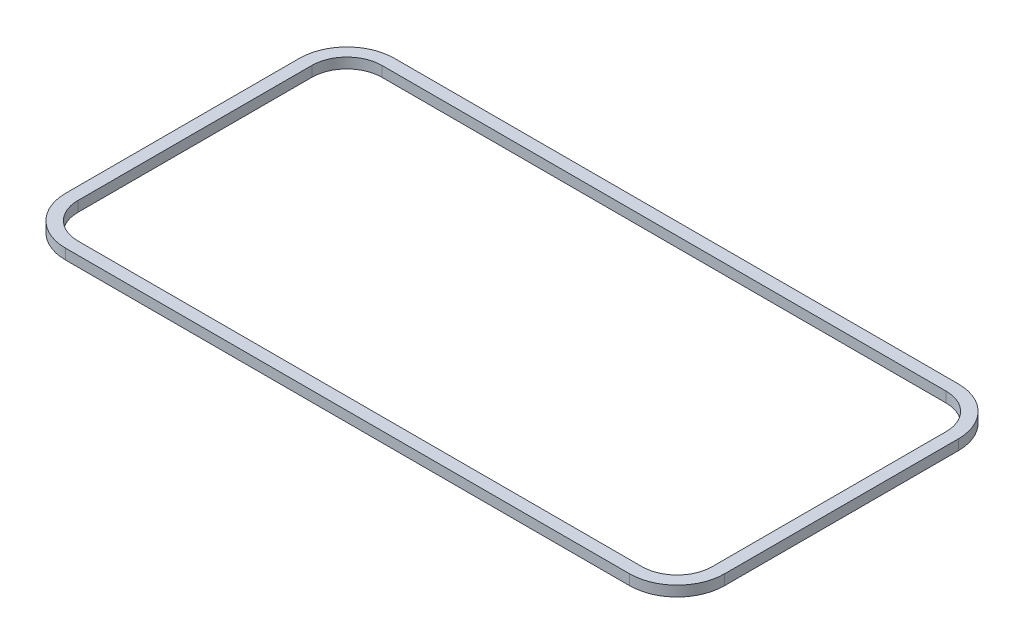
ISO-10303-21;
HEADER;
FILE_DESCRIPTION(('STEP AP214'),'2;1');
FILE_NAME('part.step','',(''),(''),'','','');
FILE_SCHEMA(('AUTOMOTIVE_DESIGN { 1 0 10303 214 1 1 1 1 }'));
ENDSEC;
DATA;
#1=APPLICATION_CONTEXT('core data for automotive mechanical design processes');
#2=APPLICATION_PROTOCOL_DEFINITION('international standard','automotive_design',2000,#1);
#3=PRODUCT_CONTEXT('',#1,'mechanical');
#4=PRODUCT('Part','Part','',(#3));
#5=PRODUCT_RELATED_PRODUCT_CATEGORY('part','',(#4));
#6=PRODUCT_DEFINITION_FORMATION('','',#4);
#7=PRODUCT_DEFINITION_CONTEXT('part definition',#1,'design');
#8=PRODUCT_DEFINITION('design','',#6,#7);
#9=PRODUCT_DEFINITION_SHAPE('','',#8);
#10=(LENGTH_UNIT() NAMED_UNIT(*) SI_UNIT(.MILLI.,.METRE.));
#11=(NAMED_UNIT(*) PLANE_ANGLE_UNIT() SI_UNIT($,.RADIAN.));
#12=(NAMED_UNIT(*) SI_UNIT($,.STERADIAN.) SOLID_ANGLE_UNIT());
#13=UNCERTAINTY_MEASURE_WITH_UNIT(LENGTH_MEASURE(1.E-05),#10,'distance_accuracy_value','');
#14=(GEOMETRIC_REPRESENTATION_CONTEXT(3) GLOBAL_UNCERTAINTY_ASSIGNED_CONTEXT((#13)) GLOBAL_UNIT_ASSIGNED_CONTEXT((#10,
#11,#12)) REPRESENTATION_CONTEXT('',''));
#15=CARTESIAN_POINT('',(0.,0.,0.));
#16=DIRECTION('',(0.,0.,1.));
#17=DIRECTION('',(1.,0.,0.));
#18=AXIS2_PLACEMENT_3D('',#15,#16,#17);
#19=CARTESIAN_POINT('',(-41.,0.,17.));
#20=DIRECTION('',(0.,1.,0.));
#21=DIRECTION('',(0.,0.,1.));
#22=AXIS2_PLACEMENT_3D('',#19,#20,#21);
#23=PLANE('',#22);
#24=CARTESIAN_POINT('',(-41.,0.,17.));
#25=DIRECTION('',(0.,1.,0.));
#26=DIRECTION('',(0.,0.,1.));
#27=AXIS2_PLACEMENT_3D('',#24,#25,#26);
#28=CIRCLE('',#27,6.9);
#29=CARTESIAN_POINT('',(-47.9,0.,17.));
#30=VERTEX_POINT('',#29);
#31=CARTESIAN_POINT('',(-41.,0.,23.9));
#32=VERTEX_POINT('',#31);
#33=EDGE_CURVE('E222',#30,#32,#28,.T.);
#34=ORIENTED_EDGE('',*,*,#33,.T.);
#35=DIRECTION('',(1.,0.,0.));
#36=VECTOR('',#35,1.);
#37=CARTESIAN_POINT('',(-41.,0.,23.9));
#38=LINE('',#37,#36);
#39=CARTESIAN_POINT('',(41.,0.,23.9));
#40=VERTEX_POINT('',#39);
#41=EDGE_CURVE('E221',#32,#40,#38,.T.);
#42=ORIENTED_EDGE('',*,*,#41,.T.);
#43=CARTESIAN_POINT('',(41.,0.,17.));
#44=DIRECTION('',(0.,1.,0.));
#45=DIRECTION('',(0.,0.,1.));
#46=AXIS2_PLACEMENT_3D('',#43,#44,#45);
#47=CIRCLE('',#46,6.9);
#48=CARTESIAN_POINT('',(47.9,0.,17.));
#49=VERTEX_POINT('',#48);
#50=EDGE_CURVE('E230',#40,#49,#47,.T.);
#51=ORIENTED_EDGE('',*,*,#50,.T.);
#52=DIRECTION('',(0.,0.,-1.));
#53=VECTOR('',#52,1.);
#54=CARTESIAN_POINT('',(47.9,0.,17.));
#55=LINE('',#54,#53);
#56=CARTESIAN_POINT('',(47.9,0.,-17.));
#57=VERTEX_POINT('',#56);
#58=EDGE_CURVE('E228',#49,#57,#55,.T.);
#59=ORIENTED_EDGE('',*,*,#58,.T.);
#60=CARTESIAN_POINT('',(41.,0.,-17.));
#61=DIRECTION('',(0.,1.,0.));
#62=DIRECTION('',(0.,0.,1.));
#63=AXIS2_PLACEMENT_3D('',#60,#61,#62);
#64=CIRCLE('',#63,6.9);
#65=CARTESIAN_POINT('',(41.,0.,-23.9));
#66=VERTEX_POINT('',#65);
#67=EDGE_CURVE('E231',#57,#66,#64,.T.);
#68=ORIENTED_EDGE('',*,*,#67,.T.);
#69=DIRECTION('',(-1.,0.,0.));
#70=VECTOR('',#69,1.);
#71=CARTESIAN_POINT('',(41.,0.,-23.9));
#72=LINE('',#71,#70);
#73=CARTESIAN_POINT('',(-41.,0.,-23.9));
#74=VERTEX_POINT('',#73);
#75=EDGE_CURVE('E233',#66,#74,#72,.T.);
#76=ORIENTED_EDGE('',*,*,#75,.T.);
#77=CARTESIAN_POINT('',(-41.,0.,-17.));
#78=DIRECTION('',(0.,1.,0.));
#79=DIRECTION('',(0.,0.,1.));
#80=AXIS2_PLACEMENT_3D('',#77,#78,#79);
#81=CIRCLE('',#80,6.9);
#82=CARTESIAN_POINT('',(-47.9,0.,-17.));
#83=VERTEX_POINT('',#82);
#84=EDGE_CURVE('E234',#74,#83,#81,.T.);
#85=ORIENTED_EDGE('',*,*,#84,.T.);
#86=DIRECTION('',(0.,0.,1.));
#87=VECTOR('',#86,1.);
#88=CARTESIAN_POINT('',(-47.9,0.,-17.));
#89=LINE('',#88,#87);
#90=EDGE_CURVE('E240',#83,#30,#89,.T.);
#91=ORIENTED_EDGE('',*,*,#90,.T.);
#92=EDGE_LOOP('',(#34,#42,#51,#59,#68,#76,#85,#91));
#93=FACE_BOUND('',#92,.T.);
#94=DIRECTION('',(1.,0.,0.));
#95=VECTOR('',#94,1.);
#96=CARTESIAN_POINT('',(-41.,0.,22.1));
#97=LINE('',#96,#95);
#98=CARTESIAN_POINT('',(-41.,0.,22.1));
#99=VERTEX_POINT('',#98);
#100=CARTESIAN_POINT('',(41.,0.,22.1));
#101=VERTEX_POINT('',#100);
#102=EDGE_CURVE('E163',#99,#101,#97,.T.);
#103=ORIENTED_EDGE('',*,*,#102,.F.);
#104=CARTESIAN_POINT('',(-41.,0.,17.));
#105=DIRECTION('',(0.,1.,0.));
#106=DIRECTION('',(0.,0.,1.));
#107=AXIS2_PLACEMENT_3D('',#104,#105,#106);
#108=CIRCLE('',#107,5.1);
#109=CARTESIAN_POINT('',(-46.1,0.,17.));
#110=VERTEX_POINT('',#109);
#111=EDGE_CURVE('E156',#110,#99,#108,.T.);
#112=ORIENTED_EDGE('',*,*,#111,.F.);
#113=DIRECTION('',(0.,0.,1.));
#114=VECTOR('',#113,1.);
#115=CARTESIAN_POINT('',(-46.1,0.,-17.));
#116=LINE('',#115,#114);
#117=CARTESIAN_POINT('',(-46.1,0.,-17.));
#118=VERTEX_POINT('',#117);
#119=EDGE_CURVE('E188',#118,#110,#116,.T.);
#120=ORIENTED_EDGE('',*,*,#119,.F.);
#121=CARTESIAN_POINT('',(-41.,0.,-17.));
#122=DIRECTION('',(0.,1.,0.));
#123=DIRECTION('',(0.,0.,1.));
#124=AXIS2_PLACEMENT_3D('',#121,#122,#123);
#125=CIRCLE('',#124,5.1);
#126=CARTESIAN_POINT('',(-41.,0.,-22.1));
#127=VERTEX_POINT('',#126);
#128=EDGE_CURVE('E190',#127,#118,#125,.T.);
#129=ORIENTED_EDGE('',*,*,#128,.F.);
#130=DIRECTION('',(-1.,0.,0.));
#131=VECTOR('',#130,1.);
#132=CARTESIAN_POINT('',(41.,0.,-22.1));
#133=LINE('',#132,#131);
#134=CARTESIAN_POINT('',(41.,0.,-22.1));
#135=VERTEX_POINT('',#134);
#136=EDGE_CURVE('E183',#135,#127,#133,.T.);
#137=ORIENTED_EDGE('',*,*,#136,.F.);
#138=CARTESIAN_POINT('',(41.,0.,-17.));
#139=DIRECTION('',(0.,1.,0.));
#140=DIRECTION('',(0.,0.,1.));
#141=AXIS2_PLACEMENT_3D('',#138,#139,#140);
#142=CIRCLE('',#141,5.1);
#143=CARTESIAN_POINT('',(46.1,0.,-17.));
#144=VERTEX_POINT('',#143);
#145=EDGE_CURVE('E181',#144,#135,#142,.T.);
#146=ORIENTED_EDGE('',*,*,#145,.F.);
#147=DIRECTION('',(0.,0.,-1.));
#148=VECTOR('',#147,1.);
#149=CARTESIAN_POINT('',(46.1,0.,17.));
#150=LINE('',#149,#148);
#151=CARTESIAN_POINT('',(46.1,0.,17.));
#152=VERTEX_POINT('',#151);
#153=EDGE_CURVE('E177',#152,#144,#150,.T.);
#154=ORIENTED_EDGE('',*,*,#153,.F.);
#155=CARTESIAN_POINT('',(41.,0.,17.));
#156=DIRECTION('',(0.,1.,0.));
#157=DIRECTION('',(0.,0.,1.));
#158=AXIS2_PLACEMENT_3D('',#155,#156,#157);
#159=CIRCLE('',#158,5.1);
#160=EDGE_CURVE('E180',#101,#152,#159,.T.);
#161=ORIENTED_EDGE('',*,*,#160,.F.);
#162=EDGE_LOOP('',(#103,#112,#120,#129,#137,#146,#154,#161));
#163=FACE_BOUND('',#162,.T.);
#164=ADVANCED_FACE('F43',(#93,#163),#23,.T.);
#165=CARTESIAN_POINT('',(-41.,-1.5,17.));
#166=DIRECTION('',(0.,1.,0.));
#167=DIRECTION('',(0.,0.,1.));
#168=AXIS2_PLACEMENT_3D('',#165,#166,#167);
#169=PLANE('',#168);
#170=CARTESIAN_POINT('',(-41.,-1.5,17.));
#171=DIRECTION('',(0.,1.,0.));
#172=DIRECTION('',(0.,0.,1.));
#173=AXIS2_PLACEMENT_3D('',#170,#171,#172);
#174=CIRCLE('',#173,6.9);
#175=CARTESIAN_POINT('',(-47.9,-1.5,17.));
#176=VERTEX_POINT('',#175);
#177=CARTESIAN_POINT('',(-41.,-1.5,23.9));
#178=VERTEX_POINT('',#177);
#179=EDGE_CURVE('E175',#176,#178,#174,.T.);
#180=ORIENTED_EDGE('',*,*,#179,.F.);
#181=DIRECTION('',(0.,0.,1.));
#182=VECTOR('',#181,1.);
#183=CARTESIAN_POINT('',(-47.9,-1.5,-17.));
#184=LINE('',#183,#182);
#185=CARTESIAN_POINT('',(-47.9,-1.5,-17.));
#186=VERTEX_POINT('',#185);
#187=EDGE_CURVE('E223',#186,#176,#184,.T.);
#188=ORIENTED_EDGE('',*,*,#187,.F.);
#189=CARTESIAN_POINT('',(-41.,-1.5,-17.));
#190=DIRECTION('',(0.,1.,0.));
#191=DIRECTION('',(0.,0.,1.));
#192=AXIS2_PLACEMENT_3D('',#189,#190,#191);
#193=CIRCLE('',#192,6.9);
#194=CARTESIAN_POINT('',(-41.,-1.5,-23.9));
#195=VERTEX_POINT('',#194);
#196=EDGE_CURVE('E252',#195,#186,#193,.T.);
#197=ORIENTED_EDGE('',*,*,#196,.F.);
#198=DIRECTION('',(-1.,0.,0.));
#199=VECTOR('',#198,1.);
#200=CARTESIAN_POINT('',(41.,-1.5,-23.9));
#201=LINE('',#200,#199);
#202=CARTESIAN_POINT('',(41.,-1.5,-23.9));
#203=VERTEX_POINT('',#202);
#204=EDGE_CURVE('E249',#203,#195,#201,.T.);
#205=ORIENTED_EDGE('',*,*,#204,.F.);
#206=CARTESIAN_POINT('',(41.,-1.5,-17.));
#207=DIRECTION('',(0.,1.,0.));
#208=DIRECTION('',(0.,0.,1.));
#209=AXIS2_PLACEMENT_3D('',#206,#207,#208);
#210=CIRCLE('',#209,6.9);
#211=CARTESIAN_POINT('',(47.9,-1.5,-17.));
#212=VERTEX_POINT('',#211);
#213=EDGE_CURVE('E248',#212,#203,#210,.T.);
#214=ORIENTED_EDGE('',*,*,#213,.F.);
#215=DIRECTION('',(0.,0.,-1.));
#216=VECTOR('',#215,1.);
#217=CARTESIAN_POINT('',(47.9,-1.5,17.));
#218=LINE('',#217,#216);
#219=CARTESIAN_POINT('',(47.9,-1.5,17.));
#220=VERTEX_POINT('',#219);
#221=EDGE_CURVE('E246',#220,#212,#218,.T.);
#222=ORIENTED_EDGE('',*,*,#221,.F.);
#223=CARTESIAN_POINT('',(41.,-1.5,17.));
#224=DIRECTION('',(0.,1.,0.));
#225=DIRECTION('',(0.,0.,1.));
#226=AXIS2_PLACEMENT_3D('',#223,#224,#225);
#227=CIRCLE('',#226,6.9);
#228=CARTESIAN_POINT('',(41.,-1.5,23.9));
#229=VERTEX_POINT('',#228);
#230=EDGE_CURVE('E243',#229,#220,#227,.T.);
#231=ORIENTED_EDGE('',*,*,#230,.F.);
#232=DIRECTION('',(1.,0.,0.));
#233=VECTOR('',#232,1.);
#234=CARTESIAN_POINT('',(-41.,-1.5,23.9));
#235=LINE('',#234,#233);
#236=EDGE_CURVE('E245',#178,#229,#235,.T.);
#237=ORIENTED_EDGE('',*,*,#236,.F.);
#238=EDGE_LOOP('',(#180,#188,#197,#205,#214,#222,#231,#237));
#239=FACE_BOUND('',#238,.T.);
#240=CARTESIAN_POINT('',(-41.,-1.5,17.));
#241=DIRECTION('',(0.,1.,0.));
#242=DIRECTION('',(0.,0.,1.));
#243=AXIS2_PLACEMENT_3D('',#240,#241,#242);
#244=CIRCLE('',#243,5.1);
#245=CARTESIAN_POINT('',(-46.1,-1.5,17.));
#246=VERTEX_POINT('',#245);
#247=CARTESIAN_POINT('',(-41.,-1.5,22.1));
#248=VERTEX_POINT('',#247);
#249=EDGE_CURVE('E66',#246,#248,#244,.T.);
#250=ORIENTED_EDGE('',*,*,#249,.T.);
#251=DIRECTION('',(1.,0.,0.));
#252=VECTOR('',#251,1.);
#253=CARTESIAN_POINT('',(-41.,-1.5,22.1));
#254=LINE('',#253,#252);
#255=CARTESIAN_POINT('',(41.,-1.5,22.1));
#256=VERTEX_POINT('',#255);
#257=EDGE_CURVE('E171',#248,#256,#254,.T.);
#258=ORIENTED_EDGE('',*,*,#257,.T.);
#259=CARTESIAN_POINT('',(41.,-1.5,17.));
#260=DIRECTION('',(0.,1.,0.));
#261=DIRECTION('',(0.,0.,1.));
#262=AXIS2_PLACEMENT_3D('',#259,#260,#261);
#263=CIRCLE('',#262,5.1);
#264=CARTESIAN_POINT('',(46.1,-1.5,17.));
#265=VERTEX_POINT('',#264);
#266=EDGE_CURVE('E193',#256,#265,#263,.T.);
#267=ORIENTED_EDGE('',*,*,#266,.T.);
#268=DIRECTION('',(0.,0.,-1.));
#269=VECTOR('',#268,1.);
#270=CARTESIAN_POINT('',(46.1,-1.5,17.));
#271=LINE('',#270,#269);
#272=CARTESIAN_POINT('',(46.1,-1.5,-17.));
#273=VERTEX_POINT('',#272);
#274=EDGE_CURVE('E198',#265,#273,#271,.T.);
#275=ORIENTED_EDGE('',*,*,#274,.T.);
#276=CARTESIAN_POINT('',(41.,-1.5,-17.));
#277=DIRECTION('',(0.,1.,0.));
#278=DIRECTION('',(0.,0.,1.));
#279=AXIS2_PLACEMENT_3D('',#276,#277,#278);
#280=CIRCLE('',#279,5.1);
#281=CARTESIAN_POINT('',(41.,-1.5,-22.1));
#282=VERTEX_POINT('',#281);
#283=EDGE_CURVE('E200',#273,#282,#280,.T.);
#284=ORIENTED_EDGE('',*,*,#283,.T.);
#285=DIRECTION('',(-1.,0.,0.));
#286=VECTOR('',#285,1.);
#287=CARTESIAN_POINT('',(41.,-1.5,-22.1));
#288=LINE('',#287,#286);
#289=CARTESIAN_POINT('',(-41.,-1.5,-22.1));
#290=VERTEX_POINT('',#289);
#291=EDGE_CURVE('E205',#282,#290,#288,.T.);
#292=ORIENTED_EDGE('',*,*,#291,.T.);
#293=CARTESIAN_POINT('',(-41.,-1.5,-17.));
#294=DIRECTION('',(0.,1.,0.));
#295=DIRECTION('',(0.,0.,1.));
#296=AXIS2_PLACEMENT_3D('',#293,#294,#295);
#297=CIRCLE('',#296,5.1);
#298=CARTESIAN_POINT('',(-46.1,-1.5,-17.));
#299=VERTEX_POINT('',#298);
#300=EDGE_CURVE('E202',#290,#299,#297,.T.);
#301=ORIENTED_EDGE('',*,*,#300,.T.);
#302=DIRECTION('',(0.,0.,1.));
#303=VECTOR('',#302,1.);
#304=CARTESIAN_POINT('',(-46.1,-1.5,-17.));
#305=LINE('',#304,#303);
#306=EDGE_CURVE('E164',#299,#246,#305,.T.);
#307=ORIENTED_EDGE('',*,*,#306,.T.);
#308=EDGE_LOOP('',(#250,#258,#267,#275,#284,#292,#301,#307));
#309=FACE_BOUND('',#308,.T.);
#310=ADVANCED_FACE('F285',(#239,#309),#169,.F.);
#311=CARTESIAN_POINT('',(-41.,0.,17.));
#312=DIRECTION('',(0.,-1.,0.));
#313=DIRECTION('',(0.,0.,-1.));
#314=AXIS2_PLACEMENT_3D('',#311,#312,#313);
#315=CYLINDRICAL_SURFACE('',#314,6.9);
#316=ORIENTED_EDGE('',*,*,#179,.T.);
#317=DIRECTION('',(0.,-1.,0.));
#318=VECTOR('',#317,1.);
#319=CARTESIAN_POINT('',(-41.,0.,23.9));
#320=LINE('',#319,#318);
#321=EDGE_CURVE('E11',#32,#178,#320,.T.);
#322=ORIENTED_EDGE('',*,*,#321,.F.);
#323=ORIENTED_EDGE('',*,*,#33,.F.);
#324=DIRECTION('',(0.,-1.,0.));
#325=VECTOR('',#324,1.);
#326=CARTESIAN_POINT('',(-47.9,0.,17.));
#327=LINE('',#326,#325);
#328=EDGE_CURVE('E239',#30,#176,#327,.T.);
#329=ORIENTED_EDGE('',*,*,#328,.T.);
#330=EDGE_LOOP('',(#316,#322,#323,#329));
#331=FACE_BOUND('',#330,.T.);
#332=ADVANCED_FACE('F44',(#331),#315,.T.);
#333=CARTESIAN_POINT('',(-41.,0.,23.9));
#334=DIRECTION('',(0.,0.,-1.));
#335=DIRECTION('',(-1.,0.,0.));
#336=AXIS2_PLACEMENT_3D('',#333,#334,#335);
#337=PLANE('',#336);
#338=ORIENTED_EDGE('',*,*,#236,.T.);
#339=DIRECTION('',(0.,-1.,0.));
#340=VECTOR('',#339,1.);
#341=CARTESIAN_POINT('',(41.,0.,23.9));
#342=LINE('',#341,#340);
#343=EDGE_CURVE('E51',#40,#229,#342,.T.);
#344=ORIENTED_EDGE('',*,*,#343,.F.);
#345=ORIENTED_EDGE('',*,*,#41,.F.);
#346=ORIENTED_EDGE('',*,*,#321,.T.);
#347=EDGE_LOOP('',(#338,#344,#345,#346));
#348=FACE_BOUND('',#347,.T.);
#349=ADVANCED_FACE('F298',(#348),#337,.F.);
#350=CARTESIAN_POINT('',(41.,0.,17.));
#351=DIRECTION('',(0.,-1.,0.));
#352=DIRECTION('',(0.,0.,-1.));
#353=AXIS2_PLACEMENT_3D('',#350,#351,#352);
#354=CYLINDRICAL_SURFACE('',#353,6.9);
#355=ORIENTED_EDGE('',*,*,#230,.T.);
#356=DIRECTION('',(0.,-1.,0.));
#357=VECTOR('',#356,1.);
#358=CARTESIAN_POINT('',(47.9,0.,17.));
#359=LINE('',#358,#357);
#360=EDGE_CURVE('E267',#49,#220,#359,.T.);
#361=ORIENTED_EDGE('',*,*,#360,.F.);
#362=ORIENTED_EDGE('',*,*,#50,.F.);
#363=ORIENTED_EDGE('',*,*,#343,.T.);
#364=EDGE_LOOP('',(#355,#361,#362,#363));
#365=FACE_BOUND('',#364,.T.);
#366=ADVANCED_FACE('F277',(#365),#354,.T.);
#367=CARTESIAN_POINT('',(47.9,0.,17.));
#368=DIRECTION('',(-1.,0.,0.));
#369=DIRECTION('',(0.,0.,1.));
#370=AXIS2_PLACEMENT_3D('',#367,#368,#369);
#371=PLANE('',#370);
#372=ORIENTED_EDGE('',*,*,#221,.T.);
#373=DIRECTION('',(0.,-1.,0.));
#374=VECTOR('',#373,1.);
#375=CARTESIAN_POINT('',(47.9,0.,-17.));
#376=LINE('',#375,#374);
#377=EDGE_CURVE('E266',#57,#212,#376,.T.);
#378=ORIENTED_EDGE('',*,*,#377,.F.);
#379=ORIENTED_EDGE('',*,*,#58,.F.);
#380=ORIENTED_EDGE('',*,*,#360,.T.);
#381=EDGE_LOOP('',(#372,#378,#379,#380));
#382=FACE_BOUND('',#381,.T.);
#383=ADVANCED_FACE('F288',(#382),#371,.F.);
#384=CARTESIAN_POINT('',(41.,0.,-17.));
#385=DIRECTION('',(0.,-1.,0.));
#386=DIRECTION('',(0.,0.,-1.));
#387=AXIS2_PLACEMENT_3D('',#384,#385,#386);
#388=CYLINDRICAL_SURFACE('',#387,6.9);
#389=ORIENTED_EDGE('',*,*,#213,.T.);
#390=DIRECTION('',(0.,-1.,0.));
#391=VECTOR('',#390,1.);
#392=CARTESIAN_POINT('',(41.,0.,-23.9));
#393=LINE('',#392,#391);
#394=EDGE_CURVE('E263',#66,#203,#393,.T.);
#395=ORIENTED_EDGE('',*,*,#394,.F.);
#396=ORIENTED_EDGE('',*,*,#67,.F.);
#397=ORIENTED_EDGE('',*,*,#377,.T.);
#398=EDGE_LOOP('',(#389,#395,#396,#397));
#399=FACE_BOUND('',#398,.T.);
#400=ADVANCED_FACE('F295',(#399),#388,.T.);
#401=CARTESIAN_POINT('',(41.,0.,-23.9));
#402=DIRECTION('',(0.,0.,1.));
#403=DIRECTION('',(1.,0.,0.));
#404=AXIS2_PLACEMENT_3D('',#401,#402,#403);
#405=PLANE('',#404);
#406=ORIENTED_EDGE('',*,*,#204,.T.);
#407=DIRECTION('',(0.,-1.,0.));
#408=VECTOR('',#407,1.);
#409=CARTESIAN_POINT('',(-41.,0.,-23.9));
#410=LINE('',#409,#408);
#411=EDGE_CURVE('E257',#74,#195,#410,.T.);
#412=ORIENTED_EDGE('',*,*,#411,.F.);
#413=ORIENTED_EDGE('',*,*,#75,.F.);
#414=ORIENTED_EDGE('',*,*,#394,.T.);
#415=EDGE_LOOP('',(#406,#412,#413,#414));
#416=FACE_BOUND('',#415,.T.);
#417=ADVANCED_FACE('F315',(#416),#405,.F.);
#418=CARTESIAN_POINT('',(-41.,0.,-17.));
#419=DIRECTION('',(0.,-1.,0.));
#420=DIRECTION('',(0.,0.,-1.));
#421=AXIS2_PLACEMENT_3D('',#418,#419,#420);
#422=CYLINDRICAL_SURFACE('',#421,6.9);
#423=ORIENTED_EDGE('',*,*,#196,.T.);
#424=DIRECTION('',(0.,-1.,0.));
#425=VECTOR('',#424,1.);
#426=CARTESIAN_POINT('',(-47.9,0.,-17.));
#427=LINE('',#426,#425);
#428=EDGE_CURVE('E260',#83,#186,#427,.T.);
#429=ORIENTED_EDGE('',*,*,#428,.F.);
#430=ORIENTED_EDGE('',*,*,#84,.F.);
#431=ORIENTED_EDGE('',*,*,#411,.T.);
#432=EDGE_LOOP('',(#423,#429,#430,#431));
#433=FACE_BOUND('',#432,.T.);
#434=ADVANCED_FACE('F309',(#433),#422,.T.);
#435=CARTESIAN_POINT('',(-47.9,0.,-17.));
#436=DIRECTION('',(1.,0.,0.));
#437=DIRECTION('',(0.,0.,-1.));
#438=AXIS2_PLACEMENT_3D('',#435,#436,#437);
#439=PLANE('',#438);
#440=ORIENTED_EDGE('',*,*,#187,.T.);
#441=ORIENTED_EDGE('',*,*,#328,.F.);
#442=ORIENTED_EDGE('',*,*,#90,.F.);
#443=ORIENTED_EDGE('',*,*,#428,.T.);
#444=EDGE_LOOP('',(#440,#441,#442,#443));
#445=FACE_BOUND('',#444,.T.);
#446=ADVANCED_FACE('F304',(#445),#439,.F.);
#447=CARTESIAN_POINT('',(-41.,0.,17.));
#448=DIRECTION('',(0.,-1.,0.));
#449=DIRECTION('',(0.,0.,-1.));
#450=AXIS2_PLACEMENT_3D('',#447,#448,#449);
#451=CYLINDRICAL_SURFACE('',#450,5.1);
#452=ORIENTED_EDGE('',*,*,#249,.F.);
#453=DIRECTION('',(0.,-1.,0.));
#454=VECTOR('',#453,1.);
#455=CARTESIAN_POINT('',(-46.1,0.,17.));
#456=LINE('',#455,#454);
#457=EDGE_CURVE('E159',#110,#246,#456,.T.);
#458=ORIENTED_EDGE('',*,*,#457,.F.);
#459=ORIENTED_EDGE('',*,*,#111,.T.);
#460=DIRECTION('',(0.,-1.,0.));
#461=VECTOR('',#460,1.);
#462=CARTESIAN_POINT('',(-41.,0.,22.1));
#463=LINE('',#462,#461);
#464=EDGE_CURVE('E157',#99,#248,#463,.T.);
#465=ORIENTED_EDGE('',*,*,#464,.T.);
#466=EDGE_LOOP('',(#452,#458,#459,#465));
#467=FACE_BOUND('',#466,.T.);
#468=ADVANCED_FACE('F158',(#467),#451,.F.);
#469=CARTESIAN_POINT('',(-41.,0.,22.1));
#470=DIRECTION('',(0.,0.,-1.));
#471=DIRECTION('',(-1.,0.,0.));
#472=AXIS2_PLACEMENT_3D('',#469,#470,#471);
#473=PLANE('',#472);
#474=ORIENTED_EDGE('',*,*,#257,.F.);
#475=ORIENTED_EDGE('',*,*,#464,.F.);
#476=ORIENTED_EDGE('',*,*,#102,.T.);
#477=DIRECTION('',(0.,-1.,0.));
#478=VECTOR('',#477,1.);
#479=CARTESIAN_POINT('',(41.,0.,22.1));
#480=LINE('',#479,#478);
#481=EDGE_CURVE('E172',#101,#256,#480,.T.);
#482=ORIENTED_EDGE('',*,*,#481,.T.);
#483=EDGE_LOOP('',(#474,#475,#476,#482));
#484=FACE_BOUND('',#483,.T.);
#485=ADVANCED_FACE('F169',(#484),#473,.T.);
#486=CARTESIAN_POINT('',(41.,0.,17.));
#487=DIRECTION('',(0.,-1.,0.));
#488=DIRECTION('',(0.,0.,-1.));
#489=AXIS2_PLACEMENT_3D('',#486,#487,#488);
#490=CYLINDRICAL_SURFACE('',#489,5.1);
#491=ORIENTED_EDGE('',*,*,#266,.F.);
#492=ORIENTED_EDGE('',*,*,#481,.F.);
#493=ORIENTED_EDGE('',*,*,#160,.T.);
#494=DIRECTION('',(0.,-1.,0.));
#495=VECTOR('',#494,1.);
#496=CARTESIAN_POINT('',(46.1,0.,17.));
#497=LINE('',#496,#495);
#498=EDGE_CURVE('E217',#152,#265,#497,.T.);
#499=ORIENTED_EDGE('',*,*,#498,.T.);
#500=EDGE_LOOP('',(#491,#492,#493,#499));
#501=FACE_BOUND('',#500,.T.);
#502=ADVANCED_FACE('F340',(#501),#490,.F.);
#503=CARTESIAN_POINT('',(46.1,0.,17.));
#504=DIRECTION('',(-1.,0.,0.));
#505=DIRECTION('',(0.,0.,1.));
#506=AXIS2_PLACEMENT_3D('',#503,#504,#505);
#507=PLANE('',#506);
#508=ORIENTED_EDGE('',*,*,#274,.F.);
#509=ORIENTED_EDGE('',*,*,#498,.F.);
#510=ORIENTED_EDGE('',*,*,#153,.T.);
#511=DIRECTION('',(0.,-1.,0.));
#512=VECTOR('',#511,1.);
#513=CARTESIAN_POINT('',(46.1,0.,-17.));
#514=LINE('',#513,#512);
#515=EDGE_CURVE('E216',#144,#273,#514,.T.);
#516=ORIENTED_EDGE('',*,*,#515,.T.);
#517=EDGE_LOOP('',(#508,#509,#510,#516));
#518=FACE_BOUND('',#517,.T.);
#519=ADVANCED_FACE('F341',(#518),#507,.T.);
#520=CARTESIAN_POINT('',(41.,0.,-17.));
#521=DIRECTION('',(0.,-1.,0.));
#522=DIRECTION('',(0.,0.,-1.));
#523=AXIS2_PLACEMENT_3D('',#520,#521,#522);
#524=CYLINDRICAL_SURFACE('',#523,5.1);
#525=ORIENTED_EDGE('',*,*,#283,.F.);
#526=ORIENTED_EDGE('',*,*,#515,.F.);
#527=ORIENTED_EDGE('',*,*,#145,.T.);
#528=DIRECTION('',(0.,-1.,0.));
#529=VECTOR('',#528,1.);
#530=CARTESIAN_POINT('',(41.,0.,-22.1));
#531=LINE('',#530,#529);
#532=EDGE_CURVE('E212',#135,#282,#531,.T.);
#533=ORIENTED_EDGE('',*,*,#532,.T.);
#534=EDGE_LOOP('',(#525,#526,#527,#533));
#535=FACE_BOUND('',#534,.T.);
#536=ADVANCED_FACE('F350',(#535),#524,.F.);
#537=CARTESIAN_POINT('',(41.,0.,-22.1));
#538=DIRECTION('',(0.,0.,1.));
#539=DIRECTION('',(1.,0.,0.));
#540=AXIS2_PLACEMENT_3D('',#537,#538,#539);
#541=PLANE('',#540);
#542=ORIENTED_EDGE('',*,*,#291,.F.);
#543=ORIENTED_EDGE('',*,*,#532,.F.);
#544=ORIENTED_EDGE('',*,*,#136,.T.);
#545=DIRECTION('',(0.,-1.,0.));
#546=VECTOR('',#545,1.);
#547=CARTESIAN_POINT('',(-41.,0.,-22.1));
#548=LINE('',#547,#546);
#549=EDGE_CURVE('E215',#127,#290,#548,.T.);
#550=ORIENTED_EDGE('',*,*,#549,.T.);
#551=EDGE_LOOP('',(#542,#543,#544,#550));
#552=FACE_BOUND('',#551,.T.);
#553=ADVANCED_FACE('F351',(#552),#541,.T.);
#554=CARTESIAN_POINT('',(-41.,0.,-17.));
#555=DIRECTION('',(0.,-1.,0.));
#556=DIRECTION('',(0.,0.,-1.));
#557=AXIS2_PLACEMENT_3D('',#554,#555,#556);
#558=CYLINDRICAL_SURFACE('',#557,5.1);
#559=ORIENTED_EDGE('',*,*,#300,.F.);
#560=ORIENTED_EDGE('',*,*,#549,.F.);
#561=ORIENTED_EDGE('',*,*,#128,.T.);
#562=DIRECTION('',(0.,-1.,0.));
#563=VECTOR('',#562,1.);
#564=CARTESIAN_POINT('',(-46.1,0.,-17.));
#565=LINE('',#564,#563);
#566=EDGE_CURVE('E59',#118,#299,#565,.T.);
#567=ORIENTED_EDGE('',*,*,#566,.T.);
#568=EDGE_LOOP('',(#559,#560,#561,#567));
#569=FACE_BOUND('',#568,.T.);
#570=ADVANCED_FACE('F354',(#569),#558,.F.);
#571=CARTESIAN_POINT('',(-46.1,0.,-17.));
#572=DIRECTION('',(1.,0.,0.));
#573=DIRECTION('',(0.,0.,-1.));
#574=AXIS2_PLACEMENT_3D('',#571,#572,#573);
#575=PLANE('',#574);
#576=ORIENTED_EDGE('',*,*,#306,.F.);
#577=ORIENTED_EDGE('',*,*,#566,.F.);
#578=ORIENTED_EDGE('',*,*,#119,.T.);
#579=ORIENTED_EDGE('',*,*,#457,.T.);
#580=EDGE_LOOP('',(#576,#577,#578,#579));
#581=FACE_BOUND('',#580,.T.);
#582=ADVANCED_FACE('F357',(#581),#575,.T.);
#583=CLOSED_SHELL('',(#164,#310,#332,#349,#366,#383,#400,#417,#434,#446,#468,#485,#502,#519,
#536,#553,#570,#582));
#584=MANIFOLD_SOLID_BREP('B2',#583);
#585=ADVANCED_BREP_SHAPE_REPRESENTATION('',(#18,#584),#14);
#586=SHAPE_DEFINITION_REPRESENTATION(#9,#585);
ENDSEC;
END-ISO-10303-21;
